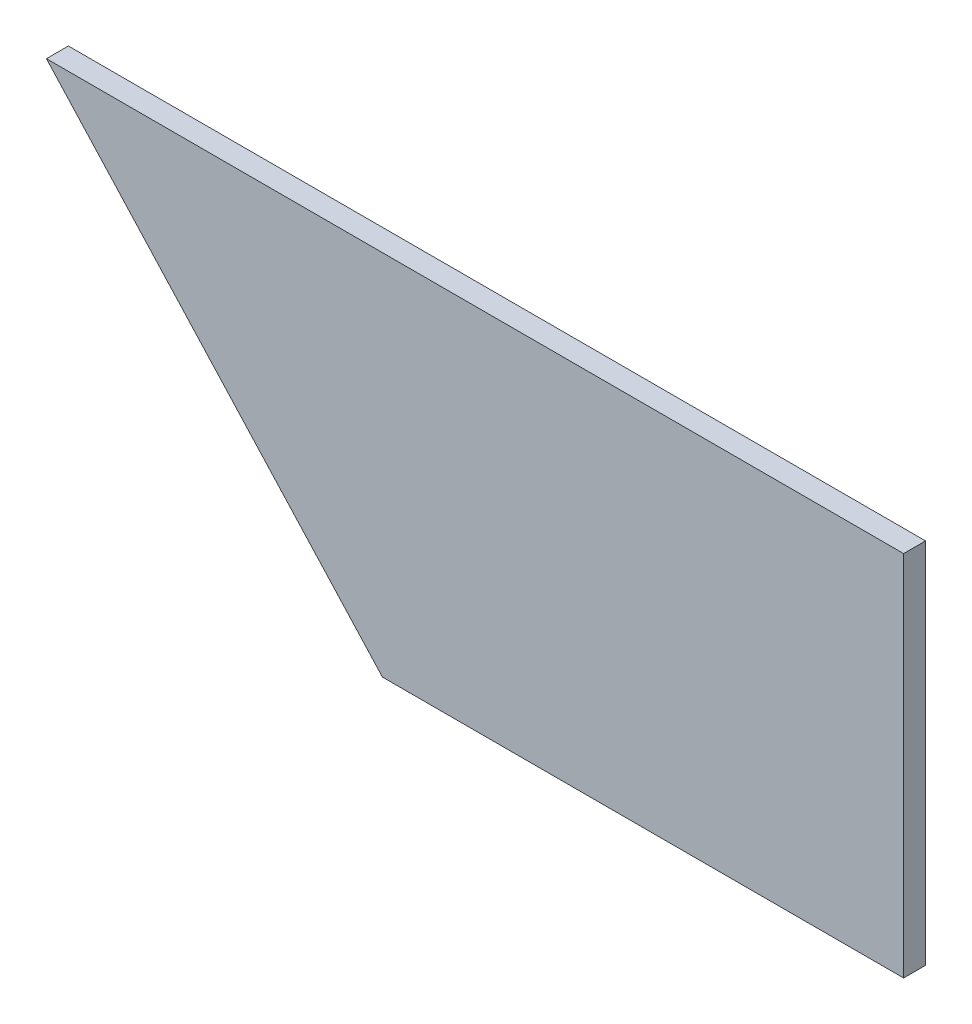
ISO-10303-21;
HEADER;
FILE_DESCRIPTION(('STEP AP214'),'2;1');
FILE_NAME('part.step','',(''),(''),'','','');
FILE_SCHEMA(('AUTOMOTIVE_DESIGN { 1 0 10303 214 1 1 1 1 }'));
ENDSEC;
DATA;
#1=APPLICATION_CONTEXT('core data for automotive mechanical design processes');
#2=APPLICATION_PROTOCOL_DEFINITION('international standard','automotive_design',2000,#1);
#3=PRODUCT_CONTEXT('',#1,'mechanical');
#4=PRODUCT('Part','Part','',(#3));
#5=PRODUCT_RELATED_PRODUCT_CATEGORY('part','',(#4));
#6=PRODUCT_DEFINITION_FORMATION('','',#4);
#7=PRODUCT_DEFINITION_CONTEXT('part definition',#1,'design');
#8=PRODUCT_DEFINITION('design','',#6,#7);
#9=PRODUCT_DEFINITION_SHAPE('','',#8);
#10=(LENGTH_UNIT() NAMED_UNIT(*) SI_UNIT(.MILLI.,.METRE.));
#11=(NAMED_UNIT(*) PLANE_ANGLE_UNIT() SI_UNIT($,.RADIAN.));
#12=(NAMED_UNIT(*) SI_UNIT($,.STERADIAN.) SOLID_ANGLE_UNIT());
#13=UNCERTAINTY_MEASURE_WITH_UNIT(LENGTH_MEASURE(1.E-05),#10,'distance_accuracy_value','');
#14=(GEOMETRIC_REPRESENTATION_CONTEXT(3) GLOBAL_UNCERTAINTY_ASSIGNED_CONTEXT((#13)) GLOBAL_UNIT_ASSIGNED_CONTEXT((#10,
#11,#12)) REPRESENTATION_CONTEXT('',''));
#15=CARTESIAN_POINT('',(0.,0.,0.));
#16=DIRECTION('',(0.,0.,1.));
#17=DIRECTION('',(1.,0.,0.));
#18=AXIS2_PLACEMENT_3D('',#15,#16,#17);
#19=CARTESIAN_POINT('',(-245.,268.,16.));
#20=DIRECTION('',(0.738067995960984,0.674726339591198,0.));
#21=DIRECTION('',(-0.674726339591198,0.738067995960984,0.));
#22=AXIS2_PLACEMENT_3D('',#19,#20,#21);
#23=PLANE('',#22);
#24=DIRECTION('',(0.674726339591198,-0.738067995960984,0.));
#25=VECTOR('',#24,1.);
#26=CARTESIAN_POINT('',(-245.,268.,0.));
#27=LINE('',#26,#25);
#28=CARTESIAN_POINT('',(-245.,268.,0.));
#29=VERTEX_POINT('',#28);
#30=CARTESIAN_POINT('',(0.,0.,0.));
#31=VERTEX_POINT('',#30);
#32=EDGE_CURVE('E97',#29,#31,#27,.T.);
#33=ORIENTED_EDGE('',*,*,#32,.T.);
#34=DIRECTION('',(0.,0.,-1.));
#35=VECTOR('',#34,1.);
#36=CARTESIAN_POINT('',(0.,0.,16.));
#37=LINE('',#36,#35);
#38=CARTESIAN_POINT('',(0.,0.,16.));
#39=VERTEX_POINT('',#38);
#40=EDGE_CURVE('E11',#39,#31,#37,.T.);
#41=ORIENTED_EDGE('',*,*,#40,.F.);
#42=DIRECTION('',(0.674726339591198,-0.738067995960984,0.));
#43=VECTOR('',#42,1.);
#44=CARTESIAN_POINT('',(-245.,268.,16.));
#45=LINE('',#44,#43);
#46=CARTESIAN_POINT('',(-245.,268.,16.));
#47=VERTEX_POINT('',#46);
#48=EDGE_CURVE('E85',#47,#39,#45,.T.);
#49=ORIENTED_EDGE('',*,*,#48,.F.);
#50=DIRECTION('',(0.,0.,-1.));
#51=VECTOR('',#50,1.);
#52=CARTESIAN_POINT('',(-245.,268.,16.));
#53=LINE('',#52,#51);
#54=EDGE_CURVE('E93',#47,#29,#53,.T.);
#55=ORIENTED_EDGE('',*,*,#54,.T.);
#56=EDGE_LOOP('',(#33,#41,#49,#55));
#57=FACE_BOUND('',#56,.T.);
#58=ADVANCED_FACE('F34',(#57),#23,.F.);
#59=CARTESIAN_POINT('',(0.,0.,16.));
#60=DIRECTION('',(0.,1.,0.));
#61=DIRECTION('',(0.,0.,1.));
#62=AXIS2_PLACEMENT_3D('',#59,#60,#61);
#63=PLANE('',#62);
#64=DIRECTION('',(1.,0.,0.));
#65=VECTOR('',#64,1.);
#66=CARTESIAN_POINT('',(0.,0.,0.));
#67=LINE('',#66,#65);
#68=CARTESIAN_POINT('',(380.,0.,0.));
#69=VERTEX_POINT('',#68);
#70=EDGE_CURVE('E89',#31,#69,#67,.T.);
#71=ORIENTED_EDGE('',*,*,#70,.T.);
#72=DIRECTION('',(0.,0.,-1.));
#73=VECTOR('',#72,1.);
#74=CARTESIAN_POINT('',(380.,0.,16.));
#75=LINE('',#74,#73);
#76=CARTESIAN_POINT('',(380.,0.,16.));
#77=VERTEX_POINT('',#76);
#78=EDGE_CURVE('E42',#77,#69,#75,.T.);
#79=ORIENTED_EDGE('',*,*,#78,.F.);
#80=DIRECTION('',(1.,0.,0.));
#81=VECTOR('',#80,1.);
#82=CARTESIAN_POINT('',(0.,0.,16.));
#83=LINE('',#82,#81);
#84=EDGE_CURVE('E80',#39,#77,#83,.T.);
#85=ORIENTED_EDGE('',*,*,#84,.F.);
#86=ORIENTED_EDGE('',*,*,#40,.T.);
#87=EDGE_LOOP('',(#71,#79,#85,#86));
#88=FACE_BOUND('',#87,.T.);
#89=ADVANCED_FACE('F88',(#88),#63,.F.);
#90=CARTESIAN_POINT('',(380.,0.,16.));
#91=DIRECTION('',(-1.,0.,0.));
#92=DIRECTION('',(0.,0.,1.));
#93=AXIS2_PLACEMENT_3D('',#90,#91,#92);
#94=PLANE('',#93);
#95=DIRECTION('',(0.,1.,0.));
#96=VECTOR('',#95,1.);
#97=CARTESIAN_POINT('',(380.,0.,0.));
#98=LINE('',#97,#96);
#99=CARTESIAN_POINT('',(380.,268.,0.));
#100=VERTEX_POINT('',#99);
#101=EDGE_CURVE('E67',#69,#100,#98,.T.);
#102=ORIENTED_EDGE('',*,*,#101,.T.);
#103=DIRECTION('',(0.,0.,-1.));
#104=VECTOR('',#103,1.);
#105=CARTESIAN_POINT('',(380.,268.,16.));
#106=LINE('',#105,#104);
#107=CARTESIAN_POINT('',(380.,268.,16.));
#108=VERTEX_POINT('',#107);
#109=EDGE_CURVE('E90',#108,#100,#106,.T.);
#110=ORIENTED_EDGE('',*,*,#109,.F.);
#111=DIRECTION('',(0.,1.,0.));
#112=VECTOR('',#111,1.);
#113=CARTESIAN_POINT('',(380.,0.,16.));
#114=LINE('',#113,#112);
#115=EDGE_CURVE('E83',#77,#108,#114,.T.);
#116=ORIENTED_EDGE('',*,*,#115,.F.);
#117=ORIENTED_EDGE('',*,*,#78,.T.);
#118=EDGE_LOOP('',(#102,#110,#116,#117));
#119=FACE_BOUND('',#118,.T.);
#120=ADVANCED_FACE('F91',(#119),#94,.F.);
#121=CARTESIAN_POINT('',(380.,268.,16.));
#122=DIRECTION('',(0.,-1.,0.));
#123=DIRECTION('',(1.,0.,0.));
#124=AXIS2_PLACEMENT_3D('',#121,#122,#123);
#125=PLANE('',#124);
#126=DIRECTION('',(-1.,0.,0.));
#127=VECTOR('',#126,1.);
#128=CARTESIAN_POINT('',(380.,268.,0.));
#129=LINE('',#128,#127);
#130=EDGE_CURVE('E73',#100,#29,#129,.T.);
#131=ORIENTED_EDGE('',*,*,#130,.T.);
#132=ORIENTED_EDGE('',*,*,#54,.F.);
#133=DIRECTION('',(-1.,0.,0.));
#134=VECTOR('',#133,1.);
#135=CARTESIAN_POINT('',(380.,268.,16.));
#136=LINE('',#135,#134);
#137=EDGE_CURVE('E50',#108,#47,#136,.T.);
#138=ORIENTED_EDGE('',*,*,#137,.F.);
#139=ORIENTED_EDGE('',*,*,#109,.T.);
#140=EDGE_LOOP('',(#131,#132,#138,#139));
#141=FACE_BOUND('',#140,.T.);
#142=ADVANCED_FACE('F104',(#141),#125,.F.);
#143=CARTESIAN_POINT('',(0.,0.,16.));
#144=DIRECTION('',(0.,0.,1.));
#145=DIRECTION('',(1.,0.,0.));
#146=AXIS2_PLACEMENT_3D('',#143,#144,#145);
#147=PLANE('',#146);
#148=ORIENTED_EDGE('',*,*,#48,.T.);
#149=ORIENTED_EDGE('',*,*,#84,.T.);
#150=ORIENTED_EDGE('',*,*,#115,.T.);
#151=ORIENTED_EDGE('',*,*,#137,.T.);
#152=EDGE_LOOP('',(#148,#149,#150,#151));
#153=FACE_BOUND('',#152,.T.);
#154=ADVANCED_FACE('F81',(#153),#147,.T.);
#155=CARTESIAN_POINT('',(0.,0.,0.));
#156=DIRECTION('',(0.,0.,1.));
#157=DIRECTION('',(1.,0.,0.));
#158=AXIS2_PLACEMENT_3D('',#155,#156,#157);
#159=PLANE('',#158);
#160=ORIENTED_EDGE('',*,*,#32,.F.);
#161=ORIENTED_EDGE('',*,*,#130,.F.);
#162=ORIENTED_EDGE('',*,*,#101,.F.);
#163=ORIENTED_EDGE('',*,*,#70,.F.);
#164=EDGE_LOOP('',(#160,#161,#162,#163));
#165=FACE_BOUND('',#164,.T.);
#166=ADVANCED_FACE('F107',(#165),#159,.F.);
#167=CLOSED_SHELL('',(#58,#89,#120,#142,#154,#166));
#168=MANIFOLD_SOLID_BREP('B2',#167);
#169=ADVANCED_BREP_SHAPE_REPRESENTATION('',(#18,#168),#14);
#170=SHAPE_DEFINITION_REPRESENTATION(#9,#169);
ENDSEC;
END-ISO-10303-21;
